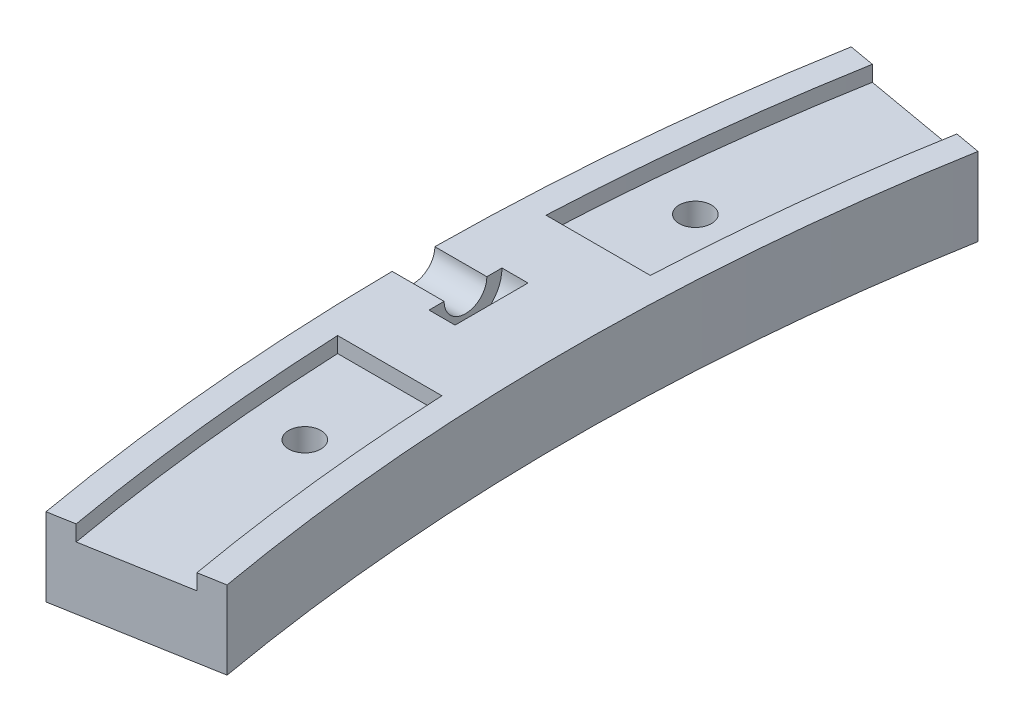
ISO-10303-21;
HEADER;
FILE_DESCRIPTION(('STEP AP214'),'2;1');
FILE_NAME('part.step','',(''),(''),'','','');
FILE_SCHEMA(('AUTOMOTIVE_DESIGN { 1 0 10303 214 1 1 1 1 }'));
ENDSEC;
DATA;
#1=APPLICATION_CONTEXT('core data for automotive mechanical design processes');
#2=APPLICATION_PROTOCOL_DEFINITION('international standard','automotive_design',2000,#1);
#3=PRODUCT_CONTEXT('',#1,'mechanical');
#4=PRODUCT('Part','Part','',(#3));
#5=PRODUCT_RELATED_PRODUCT_CATEGORY('part','',(#4));
#6=PRODUCT_DEFINITION_FORMATION('','',#4);
#7=PRODUCT_DEFINITION_CONTEXT('part definition',#1,'design');
#8=PRODUCT_DEFINITION('design','',#6,#7);
#9=PRODUCT_DEFINITION_SHAPE('','',#8);
#10=(LENGTH_UNIT() NAMED_UNIT(*) SI_UNIT(.MILLI.,.METRE.));
#11=(NAMED_UNIT(*) PLANE_ANGLE_UNIT() SI_UNIT($,.RADIAN.));
#12=(NAMED_UNIT(*) SI_UNIT($,.STERADIAN.) SOLID_ANGLE_UNIT());
#13=UNCERTAINTY_MEASURE_WITH_UNIT(LENGTH_MEASURE(1.E-05),#10,'distance_accuracy_value','');
#14=(GEOMETRIC_REPRESENTATION_CONTEXT(3) GLOBAL_UNCERTAINTY_ASSIGNED_CONTEXT((#13)) GLOBAL_UNIT_ASSIGNED_CONTEXT((#10,
#11,#12)) REPRESENTATION_CONTEXT('',''));
#15=CARTESIAN_POINT('',(0.,0.,0.));
#16=DIRECTION('',(0.,0.,1.));
#17=DIRECTION('',(1.,0.,0.));
#18=AXIS2_PLACEMENT_3D('',#15,#16,#17);
#19=CARTESIAN_POINT('',(0.,7.5,0.));
#20=DIRECTION('',(0.,1.,0.));
#21=DIRECTION('',(0.,0.,1.));
#22=AXIS2_PLACEMENT_3D('',#19,#20,#21);
#23=PLANE('',#22);
#24=DIRECTION('',(1.,0.,0.));
#25=VECTOR('',#24,1.);
#26=CARTESIAN_POINT('',(-222.5,7.5,2.04999999999997));
#27=LINE('',#26,#25);
#28=CARTESIAN_POINT('',(-222.490555979349,7.5,2.04999999999997));
#29=VERTEX_POINT('',#28);
#30=CARTESIAN_POINT('',(-217.5,7.5,2.04999999999997));
#31=VERTEX_POINT('',#30);
#32=EDGE_CURVE('E51',#29,#31,#27,.T.);
#33=ORIENTED_EDGE('',*,*,#32,.F.);
#34=CARTESIAN_POINT('',(0.,7.5,0.));
#35=DIRECTION('',(0.,1.,0.));
#36=DIRECTION('',(0.,0.,1.));
#37=AXIS2_PLACEMENT_3D('',#34,#35,#36);
#38=CIRCLE('',#37,222.5);
#39=CARTESIAN_POINT('',(-219.119725045216,7.5,38.6367195308921));
#40=VERTEX_POINT('',#39);
#41=EDGE_CURVE('E187',#29,#40,#38,.T.);
#42=ORIENTED_EDGE('',*,*,#41,.T.);
#43=DIRECTION('',(0.984807753012208,0.,-0.173648177666931));
#44=VECTOR('',#43,1.);
#45=CARTESIAN_POINT('',(-204.347608750033,7.5,36.0319968658881));
#46=LINE('',#45,#44);
#47=CARTESIAN_POINT('',(-216.657705662686,7.5,38.2025990867249));
#48=VERTEX_POINT('',#47);
#49=EDGE_CURVE('E201',#40,#48,#46,.T.);
#50=ORIENTED_EDGE('',*,*,#49,.T.);
#51=CARTESIAN_POINT('',(0.,7.5,0.));
#52=DIRECTION('',(0.,1.,0.));
#53=DIRECTION('',(0.,0.,1.));
#54=AXIS2_PLACEMENT_3D('',#51,#52,#53);
#55=CIRCLE('',#54,220.);
#56=CARTESIAN_POINT('',(-219.772609758359,7.5,10.));
#57=VERTEX_POINT('',#56);
#58=EDGE_CURVE('E218',#57,#48,#55,.T.);
#59=ORIENTED_EDGE('',*,*,#58,.F.);
#60=DIRECTION('',(1.,0.,0.));
#61=VECTOR('',#60,1.);
#62=CARTESIAN_POINT('',(0.,7.5,9.99999999999991));
#63=LINE('',#62,#61);
#64=CARTESIAN_POINT('',(-209.76176963403,7.5,10.));
#65=VERTEX_POINT('',#64);
#66=EDGE_CURVE('E221',#57,#65,#63,.T.);
#67=ORIENTED_EDGE('',*,*,#66,.T.);
#68=CARTESIAN_POINT('',(0.,7.5,0.));
#69=DIRECTION('',(0.,1.,0.));
#70=DIRECTION('',(0.,0.,1.));
#71=AXIS2_PLACEMENT_3D('',#68,#69,#70);
#72=CIRCLE('',#71,210.);
#73=CARTESIAN_POINT('',(-206.809628132564,7.5,36.4661173100556));
#74=VERTEX_POINT('',#73);
#75=EDGE_CURVE('E224',#65,#74,#72,.T.);
#76=ORIENTED_EDGE('',*,*,#75,.T.);
#77=CARTESIAN_POINT('',(-204.347608750033,7.5,36.0319968658881));
#78=VERTEX_POINT('',#77);
#79=EDGE_CURVE('E204',#74,#78,#46,.T.);
#80=ORIENTED_EDGE('',*,*,#79,.T.);
#81=CARTESIAN_POINT('',(0.,7.5,0.));
#82=DIRECTION('',(0.,-1.,0.));
#83=DIRECTION('',(0.,0.,1.));
#84=AXIS2_PLACEMENT_3D('',#81,#82,#83);
#85=CIRCLE('',#84,207.5);
#86=CARTESIAN_POINT('',(-204.347608750033,7.5,-36.0319968658881));
#87=VERTEX_POINT('',#86);
#88=EDGE_CURVE('E199',#78,#87,#85,.T.);
#89=ORIENTED_EDGE('',*,*,#88,.T.);
#90=DIRECTION('',(-0.984807753012208,0.,-0.173648177666931));
#91=VECTOR('',#90,1.);
#92=CARTESIAN_POINT('',(-219.119725045216,7.5,-38.6367195308921));
#93=LINE('',#92,#91);
#94=CARTESIAN_POINT('',(-206.809628132564,7.5,-36.4661173100556));
#95=VERTEX_POINT('',#94);
#96=EDGE_CURVE('E184',#87,#95,#93,.T.);
#97=ORIENTED_EDGE('',*,*,#96,.T.);
#98=CARTESIAN_POINT('',(0.,7.5,0.));
#99=DIRECTION('',(0.,1.,0.));
#100=DIRECTION('',(0.,0.,1.));
#101=AXIS2_PLACEMENT_3D('',#98,#99,#100);
#102=CIRCLE('',#101,210.);
#103=CARTESIAN_POINT('',(-209.76176963403,7.5,-9.99999999999995));
#104=VERTEX_POINT('',#103);
#105=EDGE_CURVE('E217',#95,#104,#102,.T.);
#106=ORIENTED_EDGE('',*,*,#105,.T.);
#107=DIRECTION('',(-1.,0.,0.));
#108=VECTOR('',#107,1.);
#109=CARTESIAN_POINT('',(0.,7.5,-9.99999999999991));
#110=LINE('',#109,#108);
#111=CARTESIAN_POINT('',(-219.772609758359,7.5,-9.99999999999995));
#112=VERTEX_POINT('',#111);
#113=EDGE_CURVE('E245',#104,#112,#110,.T.);
#114=ORIENTED_EDGE('',*,*,#113,.T.);
#115=CARTESIAN_POINT('',(0.,7.5,0.));
#116=DIRECTION('',(0.,1.,0.));
#117=DIRECTION('',(0.,0.,1.));
#118=AXIS2_PLACEMENT_3D('',#115,#116,#117);
#119=CIRCLE('',#118,220.);
#120=CARTESIAN_POINT('',(-216.657705662686,7.5,-38.2025990867247));
#121=VERTEX_POINT('',#120);
#122=EDGE_CURVE('E249',#121,#112,#119,.T.);
#123=ORIENTED_EDGE('',*,*,#122,.F.);
#124=CARTESIAN_POINT('',(-219.119725045216,7.5,-38.6367195308921));
#125=VERTEX_POINT('',#124);
#126=EDGE_CURVE('E198',#121,#125,#93,.T.);
#127=ORIENTED_EDGE('',*,*,#126,.T.);
#128=CARTESIAN_POINT('',(-222.490555979349,7.5,-2.05000000000003));
#129=VERTEX_POINT('',#128);
#130=EDGE_CURVE('E159',#125,#129,#38,.T.);
#131=ORIENTED_EDGE('',*,*,#130,.T.);
#132=DIRECTION('',(1.,0.,0.));
#133=VECTOR('',#132,1.);
#134=CARTESIAN_POINT('',(-222.5,7.5,-2.05000000000003));
#135=LINE('',#134,#133);
#136=CARTESIAN_POINT('',(-217.5,7.5,-2.05000000000003));
#137=VERTEX_POINT('',#136);
#138=EDGE_CURVE('E150',#137,#129,#135,.F.);
#139=ORIENTED_EDGE('',*,*,#138,.F.);
#140=DIRECTION('',(0.,0.,-1.));
#141=VECTOR('',#140,1.);
#142=CARTESIAN_POINT('',(-217.5,7.5,0.));
#143=LINE('',#142,#141);
#144=CARTESIAN_POINT('',(-217.5,7.5,-3.50000000000003));
#145=VERTEX_POINT('',#144);
#146=EDGE_CURVE('E44',#137,#145,#143,.T.);
#147=ORIENTED_EDGE('',*,*,#146,.T.);
#148=DIRECTION('',(1.,0.,0.));
#149=VECTOR('',#148,1.);
#150=CARTESIAN_POINT('',(-217.5,7.5,-3.50000000000003));
#151=LINE('',#150,#149);
#152=CARTESIAN_POINT('',(-215.,7.5,-3.50000000000003));
#153=VERTEX_POINT('',#152);
#154=EDGE_CURVE('E166',#153,#145,#151,.F.);
#155=ORIENTED_EDGE('',*,*,#154,.F.);
#156=DIRECTION('',(0.,0.,-1.));
#157=VECTOR('',#156,1.);
#158=CARTESIAN_POINT('',(-215.,7.5,0.));
#159=LINE('',#158,#157);
#160=CARTESIAN_POINT('',(-215.,7.5,3.49999999999997));
#161=VERTEX_POINT('',#160);
#162=EDGE_CURVE('E170',#161,#153,#159,.T.);
#163=ORIENTED_EDGE('',*,*,#162,.F.);
#164=DIRECTION('',(1.,0.,0.));
#165=VECTOR('',#164,1.);
#166=CARTESIAN_POINT('',(-217.5,7.5,3.49999999999997));
#167=LINE('',#166,#165);
#168=CARTESIAN_POINT('',(-217.5,7.5,3.49999999999997));
#169=VERTEX_POINT('',#168);
#170=EDGE_CURVE('E165',#169,#161,#167,.T.);
#171=ORIENTED_EDGE('',*,*,#170,.F.);
#172=EDGE_CURVE('E11',#169,#31,#143,.T.);
#173=ORIENTED_EDGE('',*,*,#172,.T.);
#174=EDGE_LOOP('',(#33,#42,#50,#59,#67,#76,#80,#89,#97,#106,#114,#123,#127,#131,#139,#147,#155,
#163,#171,#173));
#175=FACE_BOUND('',#174,.T.);
#176=ADVANCED_FACE('F34',(#175),#23,.T.);
#177=CARTESIAN_POINT('',(-204.347608750033,7.5,36.0319968658881));
#178=DIRECTION('',(-0.173648177666931,0.,-0.984807753012208));
#179=DIRECTION('',(-0.984807753012208,0.,0.173648177666931));
#180=AXIS2_PLACEMENT_3D('',#177,#178,#179);
#181=PLANE('',#180);
#182=DIRECTION('',(0.,1.,0.));
#183=VECTOR('',#182,1.);
#184=CARTESIAN_POINT('',(-206.809628132564,6.,36.4661173100556));
#185=LINE('',#184,#183);
#186=CARTESIAN_POINT('',(-206.809628132564,6.,36.4661173100556));
#187=VERTEX_POINT('',#186);
#188=EDGE_CURVE('E215',#187,#74,#185,.T.);
#189=ORIENTED_EDGE('',*,*,#188,.F.);
#190=DIRECTION('',(0.984807753012208,0.,-0.173648177666931));
#191=VECTOR('',#190,1.);
#192=CARTESIAN_POINT('',(0.,6.,0.));
#193=LINE('',#192,#191);
#194=CARTESIAN_POINT('',(-216.657705662686,6.,38.2025990867249));
#195=VERTEX_POINT('',#194);
#196=EDGE_CURVE('E210',#195,#187,#193,.T.);
#197=ORIENTED_EDGE('',*,*,#196,.F.);
#198=DIRECTION('',(0.,1.,0.));
#199=VECTOR('',#198,1.);
#200=CARTESIAN_POINT('',(-216.657705662686,6.,38.2025990867249));
#201=LINE('',#200,#199);
#202=EDGE_CURVE('E212',#195,#48,#201,.T.);
#203=ORIENTED_EDGE('',*,*,#202,.T.);
#204=ORIENTED_EDGE('',*,*,#49,.F.);
#205=DIRECTION('',(0.,-1.,0.));
#206=VECTOR('',#205,1.);
#207=CARTESIAN_POINT('',(-219.119725045216,7.5,38.6367195308921));
#208=LINE('',#207,#206);
#209=CARTESIAN_POINT('',(-219.119725045216,0.,38.6367195308921));
#210=VERTEX_POINT('',#209);
#211=EDGE_CURVE('E172',#40,#210,#208,.T.);
#212=ORIENTED_EDGE('',*,*,#211,.T.);
#213=DIRECTION('',(0.984807753012208,0.,-0.173648177666931));
#214=VECTOR('',#213,1.);
#215=CARTESIAN_POINT('',(-204.347608750033,0.,36.0319968658881));
#216=LINE('',#215,#214);
#217=CARTESIAN_POINT('',(-204.347608750033,0.,36.0319968658881));
#218=VERTEX_POINT('',#217);
#219=EDGE_CURVE('E190',#210,#218,#216,.T.);
#220=ORIENTED_EDGE('',*,*,#219,.T.);
#221=DIRECTION('',(0.,-1.,0.));
#222=VECTOR('',#221,1.);
#223=CARTESIAN_POINT('',(-204.347608750033,7.5,36.0319968658881));
#224=LINE('',#223,#222);
#225=EDGE_CURVE('E175',#78,#218,#224,.T.);
#226=ORIENTED_EDGE('',*,*,#225,.F.);
#227=ORIENTED_EDGE('',*,*,#79,.F.);
#228=EDGE_LOOP('',(#189,#197,#203,#204,#212,#220,#226,#227));
#229=FACE_BOUND('',#228,.T.);
#230=ADVANCED_FACE('F322',(#229),#181,.F.);
#231=CARTESIAN_POINT('',(-219.119725045216,7.5,-38.6367195308921));
#232=DIRECTION('',(-0.173648177666931,0.,0.984807753012208));
#233=DIRECTION('',(0.984807753012208,0.,0.173648177666931));
#234=AXIS2_PLACEMENT_3D('',#231,#232,#233);
#235=PLANE('',#234);
#236=DIRECTION('',(0.,1.,0.));
#237=VECTOR('',#236,1.);
#238=CARTESIAN_POINT('',(-206.809628132564,6.,-36.4661173100556));
#239=LINE('',#238,#237);
#240=CARTESIAN_POINT('',(-206.809628132564,6.,-36.4661173100556));
#241=VERTEX_POINT('',#240);
#242=EDGE_CURVE('E235',#241,#95,#239,.T.);
#243=ORIENTED_EDGE('',*,*,#242,.T.);
#244=ORIENTED_EDGE('',*,*,#96,.F.);
#245=DIRECTION('',(0.,-1.,0.));
#246=VECTOR('',#245,1.);
#247=CARTESIAN_POINT('',(-204.347608750033,7.5,-36.0319968658881));
#248=LINE('',#247,#246);
#249=CARTESIAN_POINT('',(-204.347608750033,0.,-36.0319968658881));
#250=VERTEX_POINT('',#249);
#251=EDGE_CURVE('E178',#87,#250,#248,.T.);
#252=ORIENTED_EDGE('',*,*,#251,.T.);
#253=DIRECTION('',(-0.984807753012208,0.,-0.173648177666931));
#254=VECTOR('',#253,1.);
#255=CARTESIAN_POINT('',(-219.119725045216,0.,-38.6367195308921));
#256=LINE('',#255,#254);
#257=CARTESIAN_POINT('',(-219.119725045216,0.,-38.6367195308921));
#258=VERTEX_POINT('',#257);
#259=EDGE_CURVE('E185',#250,#258,#256,.T.);
#260=ORIENTED_EDGE('',*,*,#259,.T.);
#261=DIRECTION('',(0.,-1.,0.));
#262=VECTOR('',#261,1.);
#263=CARTESIAN_POINT('',(-219.119725045216,7.5,-38.6367195308921));
#264=LINE('',#263,#262);
#265=EDGE_CURVE('E181',#125,#258,#264,.T.);
#266=ORIENTED_EDGE('',*,*,#265,.F.);
#267=ORIENTED_EDGE('',*,*,#126,.F.);
#268=DIRECTION('',(0.,1.,0.));
#269=VECTOR('',#268,1.);
#270=CARTESIAN_POINT('',(-216.657705662686,6.,-38.2025990867249));
#271=LINE('',#270,#269);
#272=CARTESIAN_POINT('',(-216.657705662686,6.,-38.2025990867249));
#273=VERTEX_POINT('',#272);
#274=EDGE_CURVE('E238',#273,#121,#271,.T.);
#275=ORIENTED_EDGE('',*,*,#274,.F.);
#276=DIRECTION('',(-0.984807753012208,0.,-0.173648177666931));
#277=VECTOR('',#276,1.);
#278=CARTESIAN_POINT('',(0.,6.,0.));
#279=LINE('',#278,#277);
#280=EDGE_CURVE('E258',#241,#273,#279,.T.);
#281=ORIENTED_EDGE('',*,*,#280,.F.);
#282=EDGE_LOOP('',(#243,#244,#252,#260,#266,#267,#275,#281));
#283=FACE_BOUND('',#282,.T.);
#284=ADVANCED_FACE('F327',(#283),#235,.F.);
#285=CARTESIAN_POINT('',(0.,7.5,0.));
#286=DIRECTION('',(0.,-1.,0.));
#287=DIRECTION('',(0.,0.,-1.));
#288=AXIS2_PLACEMENT_3D('',#285,#286,#287);
#289=CYLINDRICAL_SURFACE('',#288,222.5);
#290=ORIENTED_EDGE('',*,*,#41,.F.);
#291=CARTESIAN_POINT('',(-222.490555979349,7.5,2.04999999999997));
#292=CARTESIAN_POINT('',(-222.490555853193,7.44232658273591,2.04999961852582));
#293=CARTESIAN_POINT('',(-222.490578432539,7.38468079797024,2.04756465186004));
#294=CARTESIAN_POINT('',(-222.490667669282,7.26980173010375,2.03785058728789));
#295=CARTESIAN_POINT('',(-222.490734324561,7.21256842732108,2.03057172207914));
#296=CARTESIAN_POINT('',(-222.490998127016,7.04219644062052,2.00153745052596));
#297=CARTESIAN_POINT('',(-222.491259119139,6.93019906962209,1.97258418310412));
#298=CARTESIAN_POINT('',(-222.491922395432,6.71266023543142,1.89628763618433));
#299=CARTESIAN_POINT('',(-222.492324745026,6.60712178827391,1.84893584008534));
#300=CARTESIAN_POINT('',(-222.493225224442,6.40549767331094,1.73719279664074));
#301=CARTESIAN_POINT('',(-222.493723335502,6.30941015935476,1.67280488624355));
#302=CARTESIAN_POINT('',(-222.494759277218,6.12940691608783,1.528810647712));
#303=CARTESIAN_POINT('',(-222.495297109798,6.04549177723629,1.44920358175867));
#304=CARTESIAN_POINT('',(-222.496351926399,5.89220321550959,1.27701872072532));
#305=CARTESIAN_POINT('',(-222.496868907233,5.82283200912952,1.18443895218724));
#306=CARTESIAN_POINT('',(-222.497823629547,5.70062000435622,0.988948748490436));
#307=CARTESIAN_POINT('',(-222.498261373116,5.64777877036207,0.88603858565461));
#308=CARTESIAN_POINT('',(-222.499008258164,5.56012691527778,0.672813784219967));
#309=CARTESIAN_POINT('',(-222.499317407892,5.52531513761627,0.562499621093217));
#310=CARTESIAN_POINT('',(-222.499772290911,5.47470576698175,0.337593283193674));
#311=CARTESIAN_POINT('',(-222.499918025559,5.4589080161792,0.223001143939176));
#312=CARTESIAN_POINT('',(-222.500029654084,5.44677459449254,-0.00721162739474809));
#313=CARTESIAN_POINT('',(-222.499995543861,5.45043936719258,-0.122832282855857));
#314=CARTESIAN_POINT('',(-222.499751323926,5.47712740500543,-0.351812431761744));
#315=CARTESIAN_POINT('',(-222.499541221303,5.50014989022826,-0.465172016112955));
#316=CARTESIAN_POINT('',(-222.498968712787,5.56489857782336,-0.686416643616531));
#317=CARTESIAN_POINT('',(-222.498606307363,5.60662472275839,-0.794301703579533));
#318=CARTESIAN_POINT('',(-222.497770029994,5.70759810314196,-1.00153977687448));
#319=CARTESIAN_POINT('',(-222.497296153409,5.76684606808123,-1.10089243475233));
#320=CARTESIAN_POINT('',(-222.496290390489,5.90117776267373,-1.28823602718818));
#321=CARTESIAN_POINT('',(-222.495758506996,5.97626071688643,-1.37622751776328));
#322=CARTESIAN_POINT('',(-222.494696719084,6.14012309572289,-1.5383492411665));
#323=CARTESIAN_POINT('',(-222.494166814478,6.2289011897666,-1.61248081903746));
#324=CARTESIAN_POINT('',(-222.493168500987,6.41767765243391,-1.74481107368285));
#325=CARTESIAN_POINT('',(-222.492700111695,6.51767957746558,-1.80300468010818));
#326=CARTESIAN_POINT('',(-222.491877588824,6.72607689915806,-1.90180418190886));
#327=CARTESIAN_POINT('',(-222.491523524952,6.83447736689001,-1.94239935218085));
#328=CARTESIAN_POINT('',(-222.490970507742,7.05647098796531,-2.00475209538937));
#329=CARTESIAN_POINT('',(-222.490771317545,7.17005592952346,-2.02653843960507));
#330=CARTESIAN_POINT('',(-222.490625600546,7.32032983287205,-2.04243088036072));
#331=CARTESIAN_POINT('',(-222.490599505858,7.35623675236226,-2.04527079922526));
#332=CARTESIAN_POINT('',(-222.490564718578,7.42809093444563,-2.04905276764423));
#333=CARTESIAN_POINT('',(-222.490555997287,7.46403803218991,-2.04999794720264));
#334=CARTESIAN_POINT('',(-222.490555979349,7.5,-2.05000000000003));
#335=B_SPLINE_CURVE_WITH_KNOTS('',3,(#291,#292,#293,#294,#295,#296,#297,#298,#299,#300,#301,
#302,#303,#304,#305,#306,#307,#308,#309,#310,#311,#312,#313,#314,#315,#316,#317,#318,#319,#320,
#321,#322,#323,#324,#325,#326,#327,#328,#329,#330,#331,#332,#333,#334),.UNSPECIFIED.,.F.,.F.,(4,
2,2,2,2,2,2,2,2,2,2,2,2,2,2,2,2,2,2,2,2,4),(0.,0.172913974408916,0.345819642746646,
0.691078278841873,1.03649692446341,1.38184796124149,1.72721574475608,2.07263612411667,
2.41804740012796,2.76343651561012,3.10882276410441,3.45421688457505,3.79959709035878,
4.14497623551822,4.4903697619666,4.83574637839547,5.18108946014372,5.5265422786558,
5.8722053332555,6.21733869614347,6.32536103964639,6.43320478870565),.UNSPECIFIED.);
#336=EDGE_CURVE('E264',#29,#129,#335,.T.);
#337=ORIENTED_EDGE('',*,*,#336,.T.);
#338=ORIENTED_EDGE('',*,*,#130,.F.);
#339=ORIENTED_EDGE('',*,*,#265,.T.);
#340=CARTESIAN_POINT('',(0.,0.,0.));
#341=DIRECTION('',(0.,1.,0.));
#342=DIRECTION('',(0.,0.,1.));
#343=AXIS2_PLACEMENT_3D('',#340,#341,#342);
#344=CIRCLE('',#343,222.5);
#345=EDGE_CURVE('E192',#258,#210,#344,.T.);
#346=ORIENTED_EDGE('',*,*,#345,.T.);
#347=ORIENTED_EDGE('',*,*,#211,.F.);
#348=EDGE_LOOP('',(#290,#337,#338,#339,#346,#347));
#349=FACE_BOUND('',#348,.T.);
#350=ADVANCED_FACE('F36',(#349),#289,.T.);
#351=CARTESIAN_POINT('',(0.,7.5,0.));
#352=DIRECTION('',(0.,-1.,0.));
#353=DIRECTION('',(0.,0.,-1.));
#354=AXIS2_PLACEMENT_3D('',#351,#352,#353);
#355=CYLINDRICAL_SURFACE('',#354,207.5);
#356=CARTESIAN_POINT('',(0.,0.,0.));
#357=DIRECTION('',(0.,-1.,0.));
#358=DIRECTION('',(0.,0.,1.));
#359=AXIS2_PLACEMENT_3D('',#356,#357,#358);
#360=CIRCLE('',#359,207.5);
#361=EDGE_CURVE('E188',#218,#250,#360,.T.);
#362=ORIENTED_EDGE('',*,*,#361,.T.);
#363=ORIENTED_EDGE('',*,*,#251,.F.);
#364=ORIENTED_EDGE('',*,*,#88,.F.);
#365=ORIENTED_EDGE('',*,*,#225,.T.);
#366=EDGE_LOOP('',(#362,#363,#364,#365));
#367=FACE_BOUND('',#366,.T.);
#368=ADVANCED_FACE('F325',(#367),#355,.F.);
#369=CARTESIAN_POINT('',(0.,0.,0.));
#370=DIRECTION('',(0.,1.,0.));
#371=DIRECTION('',(0.,0.,1.));
#372=AXIS2_PLACEMENT_3D('',#369,#370,#371);
#373=PLANE('',#372);
#374=CARTESIAN_POINT('',(-214.181860089725,0.,18.7384846907465));
#375=DIRECTION('',(0.,-1.,0.));
#376=DIRECTION('',(0.,0.,-1.));
#377=AXIS2_PLACEMENT_3D('',#374,#375,#376);
#378=CIRCLE('',#377,1.55);
#379=CARTESIAN_POINT('',(-214.181860089725,0.,17.1884846907465));
#380=VERTEX_POINT('',#379);
#381=EDGE_CURVE('E498',#380,#380,#378,.T.);
#382=ORIENTED_EDGE('',*,*,#381,.F.);
#383=EDGE_LOOP('',(#382));
#384=FACE_BOUND('',#383,.T.);
#385=CARTESIAN_POINT('',(-214.181860089725,0.,-18.7384846907466));
#386=DIRECTION('',(0.,-1.,0.));
#387=DIRECTION('',(0.,0.,-1.));
#388=AXIS2_PLACEMENT_3D('',#385,#386,#387);
#389=CIRCLE('',#388,1.55);
#390=CARTESIAN_POINT('',(-214.181860089725,0.,-20.2884846907466));
#391=VERTEX_POINT('',#390);
#392=EDGE_CURVE('E500',#391,#391,#389,.T.);
#393=ORIENTED_EDGE('',*,*,#392,.F.);
#394=EDGE_LOOP('',(#393));
#395=FACE_BOUND('',#394,.T.);
#396=ORIENTED_EDGE('',*,*,#345,.F.);
#397=ORIENTED_EDGE('',*,*,#259,.F.);
#398=ORIENTED_EDGE('',*,*,#361,.F.);
#399=ORIENTED_EDGE('',*,*,#219,.F.);
#400=EDGE_LOOP('',(#396,#397,#398,#399));
#401=FACE_BOUND('',#400,.T.);
#402=ADVANCED_FACE('F318',(#384,#395,#401),#373,.F.);
#403=CARTESIAN_POINT('',(0.,6.,0.));
#404=DIRECTION('',(0.,1.,0.));
#405=DIRECTION('',(0.,0.,1.));
#406=AXIS2_PLACEMENT_3D('',#403,#404,#405);
#407=CYLINDRICAL_SURFACE('',#406,210.);
#408=ORIENTED_EDGE('',*,*,#75,.F.);
#409=DIRECTION('',(0.,1.,0.));
#410=VECTOR('',#409,1.);
#411=CARTESIAN_POINT('',(-209.76176963403,6.,10.));
#412=LINE('',#411,#410);
#413=CARTESIAN_POINT('',(-209.76176963403,6.,10.));
#414=VERTEX_POINT('',#413);
#415=EDGE_CURVE('E206',#414,#65,#412,.T.);
#416=ORIENTED_EDGE('',*,*,#415,.F.);
#417=CARTESIAN_POINT('',(0.,6.,0.));
#418=DIRECTION('',(0.,1.,0.));
#419=DIRECTION('',(0.,0.,1.));
#420=AXIS2_PLACEMENT_3D('',#417,#418,#419);
#421=CIRCLE('',#420,210.);
#422=EDGE_CURVE('E220',#414,#187,#421,.T.);
#423=ORIENTED_EDGE('',*,*,#422,.T.);
#424=ORIENTED_EDGE('',*,*,#188,.T.);
#425=EDGE_LOOP('',(#408,#416,#423,#424));
#426=FACE_BOUND('',#425,.T.);
#427=ADVANCED_FACE('F311',(#426),#407,.T.);
#428=CARTESIAN_POINT('',(0.,6.,0.));
#429=DIRECTION('',(0.,1.,0.));
#430=DIRECTION('',(0.,0.,1.));
#431=AXIS2_PLACEMENT_3D('',#428,#429,#430);
#432=CYLINDRICAL_SURFACE('',#431,220.);
#433=ORIENTED_EDGE('',*,*,#58,.T.);
#434=ORIENTED_EDGE('',*,*,#202,.F.);
#435=CARTESIAN_POINT('',(0.,6.,0.));
#436=DIRECTION('',(0.,1.,0.));
#437=DIRECTION('',(0.,0.,1.));
#438=AXIS2_PLACEMENT_3D('',#435,#436,#437);
#439=CIRCLE('',#438,220.);
#440=CARTESIAN_POINT('',(-219.772609758359,6.,10.));
#441=VERTEX_POINT('',#440);
#442=EDGE_CURVE('E229',#441,#195,#439,.T.);
#443=ORIENTED_EDGE('',*,*,#442,.F.);
#444=DIRECTION('',(0.,1.,0.));
#445=VECTOR('',#444,1.);
#446=CARTESIAN_POINT('',(-219.772609758359,6.,10.));
#447=LINE('',#446,#445);
#448=EDGE_CURVE('E209',#441,#57,#447,.T.);
#449=ORIENTED_EDGE('',*,*,#448,.T.);
#450=EDGE_LOOP('',(#433,#434,#443,#449));
#451=FACE_BOUND('',#450,.T.);
#452=ADVANCED_FACE('F308',(#451),#432,.F.);
#453=CARTESIAN_POINT('',(0.,6.,9.99999999999991));
#454=DIRECTION('',(0.,0.,1.));
#455=DIRECTION('',(1.,0.,0.));
#456=AXIS2_PLACEMENT_3D('',#453,#454,#455);
#457=PLANE('',#456);
#458=ORIENTED_EDGE('',*,*,#66,.F.);
#459=ORIENTED_EDGE('',*,*,#448,.F.);
#460=DIRECTION('',(1.,0.,0.));
#461=VECTOR('',#460,1.);
#462=CARTESIAN_POINT('',(0.,6.,9.99999999999991));
#463=LINE('',#462,#461);
#464=EDGE_CURVE('E232',#441,#414,#463,.T.);
#465=ORIENTED_EDGE('',*,*,#464,.T.);
#466=ORIENTED_EDGE('',*,*,#415,.T.);
#467=EDGE_LOOP('',(#458,#459,#465,#466));
#468=FACE_BOUND('',#467,.T.);
#469=ADVANCED_FACE('F306',(#468),#457,.T.);
#470=CARTESIAN_POINT('',(0.,6.,0.));
#471=DIRECTION('',(0.,1.,0.));
#472=DIRECTION('',(0.,0.,1.));
#473=AXIS2_PLACEMENT_3D('',#470,#471,#472);
#474=PLANE('',#473);
#475=CARTESIAN_POINT('',(-214.181860089725,6.,18.7384846907465));
#476=DIRECTION('',(0.,1.,0.));
#477=DIRECTION('',(0.,0.,1.));
#478=AXIS2_PLACEMENT_3D('',#475,#476,#477);
#479=CIRCLE('',#478,1.55);
#480=CARTESIAN_POINT('',(-214.181860089725,6.,20.2884846907465));
#481=VERTEX_POINT('',#480);
#482=EDGE_CURVE('E495',#481,#481,#479,.T.);
#483=ORIENTED_EDGE('',*,*,#482,.F.);
#484=EDGE_LOOP('',(#483));
#485=FACE_BOUND('',#484,.T.);
#486=ORIENTED_EDGE('',*,*,#422,.F.);
#487=ORIENTED_EDGE('',*,*,#464,.F.);
#488=ORIENTED_EDGE('',*,*,#442,.T.);
#489=ORIENTED_EDGE('',*,*,#196,.T.);
#490=EDGE_LOOP('',(#486,#487,#488,#489));
#491=FACE_BOUND('',#490,.T.);
#492=ADVANCED_FACE('F302',(#485,#491),#474,.T.);
#493=CARTESIAN_POINT('',(0.,6.,0.));
#494=DIRECTION('',(0.,1.,0.));
#495=DIRECTION('',(0.,0.,1.));
#496=AXIS2_PLACEMENT_3D('',#493,#494,#495);
#497=CYLINDRICAL_SURFACE('',#496,210.);
#498=ORIENTED_EDGE('',*,*,#105,.F.);
#499=ORIENTED_EDGE('',*,*,#242,.F.);
#500=CARTESIAN_POINT('',(0.,6.,0.));
#501=DIRECTION('',(0.,1.,0.));
#502=DIRECTION('',(0.,0.,1.));
#503=AXIS2_PLACEMENT_3D('',#500,#501,#502);
#504=CIRCLE('',#503,210.);
#505=CARTESIAN_POINT('',(-209.76176963403,6.,-9.99999999999995));
#506=VERTEX_POINT('',#505);
#507=EDGE_CURVE('E248',#241,#506,#504,.T.);
#508=ORIENTED_EDGE('',*,*,#507,.T.);
#509=DIRECTION('',(0.,1.,0.));
#510=VECTOR('',#509,1.);
#511=CARTESIAN_POINT('',(-209.76176963403,6.,-9.99999999999995));
#512=LINE('',#511,#510);
#513=EDGE_CURVE('E195',#506,#104,#512,.T.);
#514=ORIENTED_EDGE('',*,*,#513,.T.);
#515=EDGE_LOOP('',(#498,#499,#508,#514));
#516=FACE_BOUND('',#515,.T.);
#517=ADVANCED_FACE('F295',(#516),#497,.T.);
#518=CARTESIAN_POINT('',(0.,6.,-9.99999999999991));
#519=DIRECTION('',(0.,0.,-1.));
#520=DIRECTION('',(-1.,0.,0.));
#521=AXIS2_PLACEMENT_3D('',#518,#519,#520);
#522=PLANE('',#521);
#523=ORIENTED_EDGE('',*,*,#113,.F.);
#524=ORIENTED_EDGE('',*,*,#513,.F.);
#525=DIRECTION('',(-1.,0.,0.));
#526=VECTOR('',#525,1.);
#527=CARTESIAN_POINT('',(0.,6.,-9.99999999999991));
#528=LINE('',#527,#526);
#529=CARTESIAN_POINT('',(-219.772609758359,6.,-9.99999999999995));
#530=VERTEX_POINT('',#529);
#531=EDGE_CURVE('E239',#506,#530,#528,.T.);
#532=ORIENTED_EDGE('',*,*,#531,.T.);
#533=DIRECTION('',(0.,1.,0.));
#534=VECTOR('',#533,1.);
#535=CARTESIAN_POINT('',(-219.772609758359,6.,-9.99999999999995));
#536=LINE('',#535,#534);
#537=EDGE_CURVE('E241',#530,#112,#536,.T.);
#538=ORIENTED_EDGE('',*,*,#537,.T.);
#539=EDGE_LOOP('',(#523,#524,#532,#538));
#540=FACE_BOUND('',#539,.T.);
#541=ADVANCED_FACE('F292',(#540),#522,.T.);
#542=CARTESIAN_POINT('',(0.,6.,0.));
#543=DIRECTION('',(0.,1.,0.));
#544=DIRECTION('',(0.,0.,1.));
#545=AXIS2_PLACEMENT_3D('',#542,#543,#544);
#546=CYLINDRICAL_SURFACE('',#545,220.);
#547=ORIENTED_EDGE('',*,*,#122,.T.);
#548=ORIENTED_EDGE('',*,*,#537,.F.);
#549=CARTESIAN_POINT('',(0.,6.,0.));
#550=DIRECTION('',(0.,1.,0.));
#551=DIRECTION('',(0.,0.,1.));
#552=AXIS2_PLACEMENT_3D('',#549,#550,#551);
#553=CIRCLE('',#552,220.);
#554=EDGE_CURVE('E255',#273,#530,#553,.T.);
#555=ORIENTED_EDGE('',*,*,#554,.F.);
#556=ORIENTED_EDGE('',*,*,#274,.T.);
#557=EDGE_LOOP('',(#547,#548,#555,#556));
#558=FACE_BOUND('',#557,.T.);
#559=ADVANCED_FACE('F290',(#558),#546,.F.);
#560=CARTESIAN_POINT('',(0.,6.,0.));
#561=DIRECTION('',(0.,1.,0.));
#562=DIRECTION('',(0.,0.,1.));
#563=AXIS2_PLACEMENT_3D('',#560,#561,#562);
#564=PLANE('',#563);
#565=CARTESIAN_POINT('',(-214.181860089725,6.,-18.7384846907466));
#566=DIRECTION('',(0.,1.,0.));
#567=DIRECTION('',(0.,0.,1.));
#568=AXIS2_PLACEMENT_3D('',#565,#566,#567);
#569=CIRCLE('',#568,1.55);
#570=CARTESIAN_POINT('',(-214.181860089725,6.,-17.1884846907466));
#571=VERTEX_POINT('',#570);
#572=EDGE_CURVE('E39',#571,#571,#569,.T.);
#573=ORIENTED_EDGE('',*,*,#572,.F.);
#574=EDGE_LOOP('',(#573));
#575=FACE_BOUND('',#574,.T.);
#576=ORIENTED_EDGE('',*,*,#507,.F.);
#577=ORIENTED_EDGE('',*,*,#280,.T.);
#578=ORIENTED_EDGE('',*,*,#554,.T.);
#579=ORIENTED_EDGE('',*,*,#531,.F.);
#580=EDGE_LOOP('',(#576,#577,#578,#579));
#581=FACE_BOUND('',#580,.T.);
#582=ADVANCED_FACE('F286',(#575,#581),#564,.T.);
#583=CARTESIAN_POINT('',(-217.5,7.5,0.));
#584=DIRECTION('',(1.,0.,0.));
#585=DIRECTION('',(0.,0.,-1.));
#586=AXIS2_PLACEMENT_3D('',#583,#584,#585);
#587=CYLINDRICAL_SURFACE('',#586,3.5);
#588=ORIENTED_EDGE('',*,*,#170,.T.);
#589=CARTESIAN_POINT('',(-215.,7.5,0.));
#590=DIRECTION('',(1.,0.,0.));
#591=DIRECTION('',(0.,0.,-1.));
#592=AXIS2_PLACEMENT_3D('',#589,#590,#591);
#593=CIRCLE('',#592,3.5);
#594=EDGE_CURVE('E58',#161,#153,#593,.T.);
#595=ORIENTED_EDGE('',*,*,#594,.T.);
#596=ORIENTED_EDGE('',*,*,#154,.T.);
#597=CARTESIAN_POINT('',(-217.5,7.5,0.));
#598=DIRECTION('',(1.,0.,0.));
#599=DIRECTION('',(0.,0.,-1.));
#600=AXIS2_PLACEMENT_3D('',#597,#598,#599);
#601=CIRCLE('',#600,3.5);
#602=EDGE_CURVE('E164',#169,#145,#601,.T.);
#603=ORIENTED_EDGE('',*,*,#602,.F.);
#604=EDGE_LOOP('',(#588,#595,#596,#603));
#605=FACE_BOUND('',#604,.T.);
#606=ADVANCED_FACE('F281',(#605),#587,.F.);
#607=CARTESIAN_POINT('',(-217.5,7.5,0.));
#608=DIRECTION('',(1.,0.,0.));
#609=DIRECTION('',(0.,0.,-1.));
#610=AXIS2_PLACEMENT_3D('',#607,#608,#609);
#611=PLANE('',#610);
#612=CARTESIAN_POINT('',(-217.5,7.5,0.));
#613=DIRECTION('',(1.,0.,0.));
#614=DIRECTION('',(0.,0.,-1.));
#615=AXIS2_PLACEMENT_3D('',#612,#613,#614);
#616=CIRCLE('',#615,2.05);
#617=EDGE_CURVE('E147',#31,#137,#616,.T.);
#618=ORIENTED_EDGE('',*,*,#617,.F.);
#619=ORIENTED_EDGE('',*,*,#172,.F.);
#620=ORIENTED_EDGE('',*,*,#602,.T.);
#621=ORIENTED_EDGE('',*,*,#146,.F.);
#622=EDGE_LOOP('',(#618,#619,#620,#621));
#623=FACE_BOUND('',#622,.T.);
#624=ADVANCED_FACE('F162',(#623),#611,.T.);
#625=CARTESIAN_POINT('',(-215.,7.5,0.));
#626=DIRECTION('',(1.,0.,0.));
#627=DIRECTION('',(0.,0.,-1.));
#628=AXIS2_PLACEMENT_3D('',#625,#626,#627);
#629=PLANE('',#628);
#630=ORIENTED_EDGE('',*,*,#162,.T.);
#631=ORIENTED_EDGE('',*,*,#594,.F.);
#632=EDGE_LOOP('',(#630,#631));
#633=FACE_BOUND('',#632,.T.);
#634=ADVANCED_FACE('F277',(#633),#629,.F.);
#635=CARTESIAN_POINT('',(-222.5,7.5,0.));
#636=DIRECTION('',(1.,0.,0.));
#637=DIRECTION('',(0.,0.,-1.));
#638=AXIS2_PLACEMENT_3D('',#635,#636,#637);
#639=CYLINDRICAL_SURFACE('',#638,2.05);
#640=ORIENTED_EDGE('',*,*,#32,.T.);
#641=ORIENTED_EDGE('',*,*,#617,.T.);
#642=ORIENTED_EDGE('',*,*,#138,.T.);
#643=ORIENTED_EDGE('',*,*,#336,.F.);
#644=EDGE_LOOP('',(#640,#641,#642,#643));
#645=FACE_BOUND('',#644,.T.);
#646=ADVANCED_FACE('F149',(#645),#639,.F.);
#647=CARTESIAN_POINT('',(-214.181860089725,0.,-18.7384846907466));
#648=DIRECTION('',(0.,-1.,0.));
#649=DIRECTION('',(0.,0.,-1.));
#650=AXIS2_PLACEMENT_3D('',#647,#648,#649);
#651=CYLINDRICAL_SURFACE('',#650,1.55);
#652=ORIENTED_EDGE('',*,*,#572,.T.);
#653=EDGE_LOOP('',(#652));
#654=FACE_BOUND('',#653,.T.);
#655=ORIENTED_EDGE('',*,*,#392,.T.);
#656=EDGE_LOOP('',(#655));
#657=FACE_BOUND('',#656,.T.);
#658=ADVANCED_FACE('F276',(#654,#657),#651,.F.);
#659=CARTESIAN_POINT('',(-214.181860089725,0.,18.7384846907465));
#660=DIRECTION('',(0.,-1.,0.));
#661=DIRECTION('',(0.,0.,-1.));
#662=AXIS2_PLACEMENT_3D('',#659,#660,#661);
#663=CYLINDRICAL_SURFACE('',#662,1.55);
#664=ORIENTED_EDGE('',*,*,#482,.T.);
#665=EDGE_LOOP('',(#664));
#666=FACE_BOUND('',#665,.T.);
#667=ORIENTED_EDGE('',*,*,#381,.T.);
#668=EDGE_LOOP('',(#667));
#669=FACE_BOUND('',#668,.T.);
#670=ADVANCED_FACE('F436',(#666,#669),#663,.F.);
#671=CLOSED_SHELL('',(#176,#230,#284,#350,#368,#402,#427,#452,#469,#492,#517,#541,#559,#582,
#606,#624,#634,#646,#658,#670));
#672=MANIFOLD_SOLID_BREP('B2',#671);
#673=ADVANCED_BREP_SHAPE_REPRESENTATION('',(#18,#672),#14);
#674=SHAPE_DEFINITION_REPRESENTATION(#9,#673);
ENDSEC;
END-ISO-10303-21;
